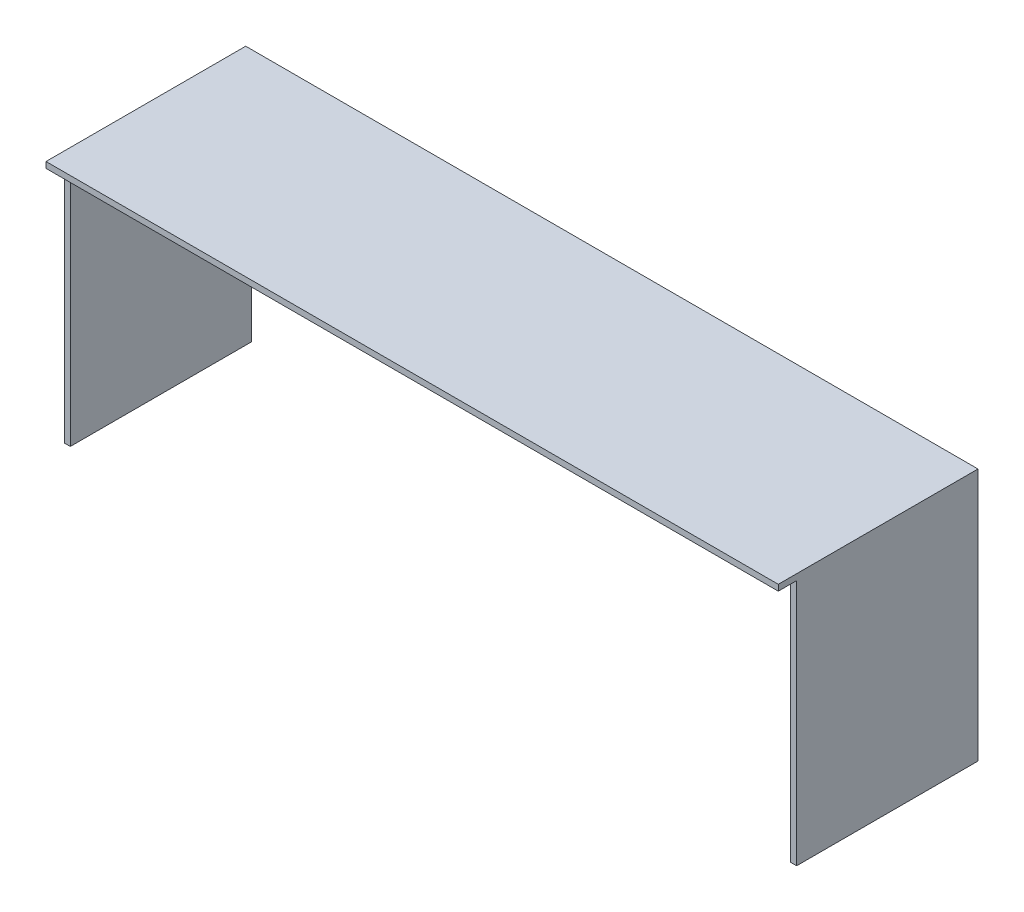
ISO-10303-21;
HEADER;
FILE_DESCRIPTION(('STEP AP214'),'2;1');
FILE_NAME('part.step','',(''),(''),'','','');
FILE_SCHEMA(('AUTOMOTIVE_DESIGN { 1 0 10303 214 1 1 1 1 }'));
ENDSEC;
DATA;
#1=APPLICATION_CONTEXT('core data for automotive mechanical design processes');
#2=APPLICATION_PROTOCOL_DEFINITION('international standard','automotive_design',2000,#1);
#3=PRODUCT_CONTEXT('',#1,'mechanical');
#4=PRODUCT('Part','Part','',(#3));
#5=PRODUCT_RELATED_PRODUCT_CATEGORY('part','',(#4));
#6=PRODUCT_DEFINITION_FORMATION('','',#4);
#7=PRODUCT_DEFINITION_CONTEXT('part definition',#1,'design');
#8=PRODUCT_DEFINITION('design','',#6,#7);
#9=PRODUCT_DEFINITION_SHAPE('','',#8);
#10=(LENGTH_UNIT() NAMED_UNIT(*) SI_UNIT(.MILLI.,.METRE.));
#11=(NAMED_UNIT(*) PLANE_ANGLE_UNIT() SI_UNIT($,.RADIAN.));
#12=(NAMED_UNIT(*) SI_UNIT($,.STERADIAN.) SOLID_ANGLE_UNIT());
#13=UNCERTAINTY_MEASURE_WITH_UNIT(LENGTH_MEASURE(1.E-05),#10,'distance_accuracy_value','');
#14=(GEOMETRIC_REPRESENTATION_CONTEXT(3) GLOBAL_UNCERTAINTY_ASSIGNED_CONTEXT((#13)) GLOBAL_UNIT_ASSIGNED_CONTEXT((#10,
#11,#12)) REPRESENTATION_CONTEXT('',''));
#15=CARTESIAN_POINT('',(0.,0.,0.));
#16=DIRECTION('',(0.,0.,1.));
#17=DIRECTION('',(1.,0.,0.));
#18=AXIS2_PLACEMENT_3D('',#15,#16,#17);
#19=CARTESIAN_POINT('',(0.,0.,0.));
#20=DIRECTION('',(0.,-1.,0.));
#21=DIRECTION('',(0.,0.,-1.));
#22=AXIS2_PLACEMENT_3D('',#19,#20,#21);
#23=PLANE('',#22);
#24=DIRECTION('',(0.,0.,1.));
#25=VECTOR('',#24,1.);
#26=CARTESIAN_POINT('',(-1082.,0.,-300.));
#27=LINE('',#26,#25);
#28=CARTESIAN_POINT('',(-1082.,0.,-235.));
#29=VERTEX_POINT('',#28);
#30=CARTESIAN_POINT('',(-1082.,0.,245.));
#31=VERTEX_POINT('',#30);
#32=EDGE_CURVE('E160',#29,#31,#27,.T.);
#33=ORIENTED_EDGE('',*,*,#32,.F.);
#34=DIRECTION('',(-1.,0.,0.));
#35=VECTOR('',#34,1.);
#36=CARTESIAN_POINT('',(1362.57797490181,0.,-235.));
#37=LINE('',#36,#35);
#38=CARTESIAN_POINT('',(1082.,0.,-235.));
#39=VERTEX_POINT('',#38);
#40=EDGE_CURVE('E152',#39,#29,#37,.T.);
#41=ORIENTED_EDGE('',*,*,#40,.F.);
#42=DIRECTION('',(0.,0.,1.));
#43=VECTOR('',#42,1.);
#44=CARTESIAN_POINT('',(1082.,0.,-300.));
#45=LINE('',#44,#43);
#46=CARTESIAN_POINT('',(1082.,0.,245.));
#47=VERTEX_POINT('',#46);
#48=EDGE_CURVE('E263',#39,#47,#45,.T.);
#49=ORIENTED_EDGE('',*,*,#48,.T.);
#50=DIRECTION('',(1.,0.,0.));
#51=VECTOR('',#50,1.);
#52=CARTESIAN_POINT('',(1100.,0.,245.));
#53=LINE('',#52,#51);
#54=CARTESIAN_POINT('',(1100.,0.,245.));
#55=VERTEX_POINT('',#54);
#56=EDGE_CURVE('E234',#47,#55,#53,.T.);
#57=ORIENTED_EDGE('',*,*,#56,.T.);
#58=DIRECTION('',(0.,0.,-1.));
#59=VECTOR('',#58,1.);
#60=CARTESIAN_POINT('',(1100.,0.,300.));
#61=LINE('',#60,#59);
#62=CARTESIAN_POINT('',(1100.,0.,300.));
#63=VERTEX_POINT('',#62);
#64=EDGE_CURVE('E177',#63,#55,#61,.T.);
#65=ORIENTED_EDGE('',*,*,#64,.F.);
#66=DIRECTION('',(1.,0.,0.));
#67=VECTOR('',#66,1.);
#68=CARTESIAN_POINT('',(-1100.,0.,300.));
#69=LINE('',#68,#67);
#70=CARTESIAN_POINT('',(-1100.,0.,300.));
#71=VERTEX_POINT('',#70);
#72=EDGE_CURVE('E182',#71,#63,#69,.T.);
#73=ORIENTED_EDGE('',*,*,#72,.F.);
#74=DIRECTION('',(0.,0.,1.));
#75=VECTOR('',#74,1.);
#76=CARTESIAN_POINT('',(-1100.,0.,300.));
#77=LINE('',#76,#75);
#78=CARTESIAN_POINT('',(-1100.,0.,245.));
#79=VERTEX_POINT('',#78);
#80=EDGE_CURVE('E193',#79,#71,#77,.T.);
#81=ORIENTED_EDGE('',*,*,#80,.F.);
#82=DIRECTION('',(-1.,0.,0.));
#83=VECTOR('',#82,1.);
#84=CARTESIAN_POINT('',(-1100.,0.,245.));
#85=LINE('',#84,#83);
#86=EDGE_CURVE('E159',#31,#79,#85,.T.);
#87=ORIENTED_EDGE('',*,*,#86,.F.);
#88=EDGE_LOOP('',(#33,#41,#49,#57,#65,#73,#81,#87));
#89=FACE_BOUND('',#88,.T.);
#90=ADVANCED_FACE('F37',(#89),#23,.T.);
#91=CARTESIAN_POINT('',(1082.,0.,-300.));
#92=VERTEX_POINT('',#91);
#93=CARTESIAN_POINT('',(1082.,0.,-253.));
#94=VERTEX_POINT('',#93);
#95=EDGE_CURVE('E59',#92,#94,#45,.T.);
#96=ORIENTED_EDGE('',*,*,#95,.T.);
#97=DIRECTION('',(-1.,0.,0.));
#98=VECTOR('',#97,1.);
#99=CARTESIAN_POINT('',(1362.57797490181,0.,-253.));
#100=LINE('',#99,#98);
#101=CARTESIAN_POINT('',(-1082.,0.,-253.));
#102=VERTEX_POINT('',#101);
#103=EDGE_CURVE('E52',#94,#102,#100,.T.);
#104=ORIENTED_EDGE('',*,*,#103,.T.);
#105=CARTESIAN_POINT('',(-1082.,0.,-300.));
#106=VERTEX_POINT('',#105);
#107=EDGE_CURVE('E149',#106,#102,#27,.T.);
#108=ORIENTED_EDGE('',*,*,#107,.F.);
#109=DIRECTION('',(-1.,0.,0.));
#110=VECTOR('',#109,1.);
#111=CARTESIAN_POINT('',(-1100.,0.,-300.));
#112=LINE('',#111,#110);
#113=EDGE_CURVE('E191',#92,#106,#112,.T.);
#114=ORIENTED_EDGE('',*,*,#113,.F.);
#115=EDGE_LOOP('',(#96,#104,#108,#114));
#116=FACE_BOUND('',#115,.T.);
#117=ADVANCED_FACE('F147',(#116),#23,.T.);
#118=CARTESIAN_POINT('',(-1082.,-742.,-300.));
#119=DIRECTION('',(-1.,0.,0.));
#120=DIRECTION('',(0.,0.,1.));
#121=AXIS2_PLACEMENT_3D('',#118,#119,#120);
#122=PLANE('',#121);
#123=DIRECTION('',(0.,-1.,0.));
#124=VECTOR('',#123,1.);
#125=CARTESIAN_POINT('',(-1082.,0.,-235.));
#126=LINE('',#125,#124);
#127=CARTESIAN_POINT('',(-1082.,-280.,-235.));
#128=VERTEX_POINT('',#127);
#129=EDGE_CURVE('E143',#29,#128,#126,.T.);
#130=ORIENTED_EDGE('',*,*,#129,.F.);
#131=ORIENTED_EDGE('',*,*,#32,.T.);
#132=DIRECTION('',(0.,1.,0.));
#133=VECTOR('',#132,1.);
#134=CARTESIAN_POINT('',(-1082.,-742.,245.));
#135=LINE('',#134,#133);
#136=CARTESIAN_POINT('',(-1082.,-742.,245.));
#137=VERTEX_POINT('',#136);
#138=EDGE_CURVE('E173',#137,#31,#135,.T.);
#139=ORIENTED_EDGE('',*,*,#138,.F.);
#140=DIRECTION('',(0.,0.,1.));
#141=VECTOR('',#140,1.);
#142=CARTESIAN_POINT('',(-1082.,-742.,-300.));
#143=LINE('',#142,#141);
#144=CARTESIAN_POINT('',(-1082.,-742.,-300.));
#145=VERTEX_POINT('',#144);
#146=EDGE_CURVE('E212',#145,#137,#143,.T.);
#147=ORIENTED_EDGE('',*,*,#146,.F.);
#148=DIRECTION('',(0.,1.,0.));
#149=VECTOR('',#148,1.);
#150=CARTESIAN_POINT('',(-1082.,-742.,-300.));
#151=LINE('',#150,#149);
#152=EDGE_CURVE('E158',#145,#106,#151,.T.);
#153=ORIENTED_EDGE('',*,*,#152,.T.);
#154=ORIENTED_EDGE('',*,*,#107,.T.);
#155=DIRECTION('',(0.,1.,0.));
#156=VECTOR('',#155,1.);
#157=CARTESIAN_POINT('',(-1082.,0.,-253.));
#158=LINE('',#157,#156);
#159=CARTESIAN_POINT('',(-1082.,-280.,-253.));
#160=VERTEX_POINT('',#159);
#161=EDGE_CURVE('E135',#160,#102,#158,.T.);
#162=ORIENTED_EDGE('',*,*,#161,.F.);
#163=DIRECTION('',(0.,0.,-1.));
#164=VECTOR('',#163,1.);
#165=CARTESIAN_POINT('',(-1082.,-280.,-253.));
#166=LINE('',#165,#164);
#167=EDGE_CURVE('E277',#128,#160,#166,.T.);
#168=ORIENTED_EDGE('',*,*,#167,.F.);
#169=EDGE_LOOP('',(#130,#131,#139,#147,#153,#154,#162,#168));
#170=FACE_BOUND('',#169,.T.);
#171=ADVANCED_FACE('F155',(#170),#122,.F.);
#172=CARTESIAN_POINT('',(1082.,-742.,-300.));
#173=DIRECTION('',(-1.,0.,0.));
#174=DIRECTION('',(0.,0.,1.));
#175=AXIS2_PLACEMENT_3D('',#172,#173,#174);
#176=PLANE('',#175);
#177=ORIENTED_EDGE('',*,*,#48,.F.);
#178=DIRECTION('',(0.,1.,0.));
#179=VECTOR('',#178,1.);
#180=CARTESIAN_POINT('',(1082.,0.,-235.));
#181=LINE('',#180,#179);
#182=CARTESIAN_POINT('',(1082.,-280.,-235.));
#183=VERTEX_POINT('',#182);
#184=EDGE_CURVE('E271',#183,#39,#181,.T.);
#185=ORIENTED_EDGE('',*,*,#184,.F.);
#186=DIRECTION('',(0.,0.,1.));
#187=VECTOR('',#186,1.);
#188=CARTESIAN_POINT('',(1082.,-280.,-253.));
#189=LINE('',#188,#187);
#190=CARTESIAN_POINT('',(1082.,-280.,-253.));
#191=VERTEX_POINT('',#190);
#192=EDGE_CURVE('E151',#191,#183,#189,.T.);
#193=ORIENTED_EDGE('',*,*,#192,.F.);
#194=DIRECTION('',(0.,-1.,0.));
#195=VECTOR('',#194,1.);
#196=CARTESIAN_POINT('',(1082.,0.,-253.));
#197=LINE('',#196,#195);
#198=EDGE_CURVE('E264',#94,#191,#197,.T.);
#199=ORIENTED_EDGE('',*,*,#198,.F.);
#200=ORIENTED_EDGE('',*,*,#95,.F.);
#201=DIRECTION('',(0.,1.,0.));
#202=VECTOR('',#201,1.);
#203=CARTESIAN_POINT('',(1082.,-742.,-300.));
#204=LINE('',#203,#202);
#205=CARTESIAN_POINT('',(1082.,-742.,-300.));
#206=VERTEX_POINT('',#205);
#207=EDGE_CURVE('E255',#206,#92,#204,.T.);
#208=ORIENTED_EDGE('',*,*,#207,.F.);
#209=DIRECTION('',(0.,0.,1.));
#210=VECTOR('',#209,1.);
#211=CARTESIAN_POINT('',(1082.,-742.,-300.));
#212=LINE('',#211,#210);
#213=CARTESIAN_POINT('',(1082.,-742.,245.));
#214=VERTEX_POINT('',#213);
#215=EDGE_CURVE('E254',#206,#214,#212,.T.);
#216=ORIENTED_EDGE('',*,*,#215,.T.);
#217=DIRECTION('',(0.,1.,0.));
#218=VECTOR('',#217,1.);
#219=CARTESIAN_POINT('',(1082.,-742.,245.));
#220=LINE('',#219,#218);
#221=EDGE_CURVE('E257',#214,#47,#220,.T.);
#222=ORIENTED_EDGE('',*,*,#221,.T.);
#223=EDGE_LOOP('',(#177,#185,#193,#199,#200,#208,#216,#222));
#224=FACE_BOUND('',#223,.T.);
#225=ADVANCED_FACE('F287',(#224),#176,.T.);
#226=CARTESIAN_POINT('',(1100.,18.,300.));
#227=DIRECTION('',(-1.,0.,0.));
#228=DIRECTION('',(0.,0.,1.));
#229=AXIS2_PLACEMENT_3D('',#226,#227,#228);
#230=PLANE('',#229);
#231=ORIENTED_EDGE('',*,*,#64,.T.);
#232=DIRECTION('',(0.,1.,0.));
#233=VECTOR('',#232,1.);
#234=CARTESIAN_POINT('',(1100.,-742.,245.));
#235=LINE('',#234,#233);
#236=CARTESIAN_POINT('',(1100.,-742.,245.));
#237=VERTEX_POINT('',#236);
#238=EDGE_CURVE('E165',#237,#55,#235,.T.);
#239=ORIENTED_EDGE('',*,*,#238,.F.);
#240=DIRECTION('',(0.,0.,-1.));
#241=VECTOR('',#240,1.);
#242=CARTESIAN_POINT('',(1100.,-742.,-300.));
#243=LINE('',#242,#241);
#244=CARTESIAN_POINT('',(1100.,-742.,-300.));
#245=VERTEX_POINT('',#244);
#246=EDGE_CURVE('E245',#237,#245,#243,.T.);
#247=ORIENTED_EDGE('',*,*,#246,.T.);
#248=DIRECTION('',(0.,-1.,0.));
#249=VECTOR('',#248,1.);
#250=CARTESIAN_POINT('',(1100.,18.,-300.));
#251=LINE('',#250,#249);
#252=CARTESIAN_POINT('',(1100.,18.,-300.));
#253=VERTEX_POINT('',#252);
#254=EDGE_CURVE('E11',#253,#245,#251,.T.);
#255=ORIENTED_EDGE('',*,*,#254,.F.);
#256=DIRECTION('',(0.,0.,-1.));
#257=VECTOR('',#256,1.);
#258=CARTESIAN_POINT('',(1100.,18.,300.));
#259=LINE('',#258,#257);
#260=CARTESIAN_POINT('',(1100.,18.,300.));
#261=VERTEX_POINT('',#260);
#262=EDGE_CURVE('E178',#261,#253,#259,.T.);
#263=ORIENTED_EDGE('',*,*,#262,.F.);
#264=DIRECTION('',(0.,-1.,0.));
#265=VECTOR('',#264,1.);
#266=CARTESIAN_POINT('',(1100.,18.,300.));
#267=LINE('',#266,#265);
#268=EDGE_CURVE('E188',#261,#63,#267,.T.);
#269=ORIENTED_EDGE('',*,*,#268,.T.);
#270=EDGE_LOOP('',(#231,#239,#247,#255,#263,#269));
#271=FACE_BOUND('',#270,.T.);
#272=ADVANCED_FACE('F39',(#271),#230,.F.);
#273=CARTESIAN_POINT('',(-1100.,18.,-300.));
#274=DIRECTION('',(0.,0.,1.));
#275=DIRECTION('',(1.,0.,0.));
#276=AXIS2_PLACEMENT_3D('',#273,#274,#275);
#277=PLANE('',#276);
#278=ORIENTED_EDGE('',*,*,#254,.T.);
#279=DIRECTION('',(-1.,0.,0.));
#280=VECTOR('',#279,1.);
#281=CARTESIAN_POINT('',(1100.,-742.,-300.));
#282=LINE('',#281,#280);
#283=EDGE_CURVE('E244',#245,#206,#282,.T.);
#284=ORIENTED_EDGE('',*,*,#283,.T.);
#285=ORIENTED_EDGE('',*,*,#207,.T.);
#286=ORIENTED_EDGE('',*,*,#113,.T.);
#287=ORIENTED_EDGE('',*,*,#152,.F.);
#288=DIRECTION('',(1.,0.,0.));
#289=VECTOR('',#288,1.);
#290=CARTESIAN_POINT('',(-1100.,-742.,-300.));
#291=LINE('',#290,#289);
#292=CARTESIAN_POINT('',(-1100.,-742.,-300.));
#293=VERTEX_POINT('',#292);
#294=EDGE_CURVE('E209',#293,#145,#291,.T.);
#295=ORIENTED_EDGE('',*,*,#294,.F.);
#296=DIRECTION('',(0.,-1.,0.));
#297=VECTOR('',#296,1.);
#298=CARTESIAN_POINT('',(-1100.,18.,-300.));
#299=LINE('',#298,#297);
#300=CARTESIAN_POINT('',(-1100.,18.,-300.));
#301=VERTEX_POINT('',#300);
#302=EDGE_CURVE('E45',#301,#293,#299,.T.);
#303=ORIENTED_EDGE('',*,*,#302,.F.);
#304=DIRECTION('',(-1.,0.,0.));
#305=VECTOR('',#304,1.);
#306=CARTESIAN_POINT('',(-1100.,18.,-300.));
#307=LINE('',#306,#305);
#308=EDGE_CURVE('E181',#253,#301,#307,.T.);
#309=ORIENTED_EDGE('',*,*,#308,.F.);
#310=EDGE_LOOP('',(#278,#284,#285,#286,#287,#295,#303,#309));
#311=FACE_BOUND('',#310,.T.);
#312=ADVANCED_FACE('F210',(#311),#277,.F.);
#313=CARTESIAN_POINT('',(-1100.,18.,300.));
#314=DIRECTION('',(1.,0.,0.));
#315=DIRECTION('',(0.,0.,-1.));
#316=AXIS2_PLACEMENT_3D('',#313,#314,#315);
#317=PLANE('',#316);
#318=ORIENTED_EDGE('',*,*,#302,.T.);
#319=DIRECTION('',(0.,0.,-1.));
#320=VECTOR('',#319,1.);
#321=CARTESIAN_POINT('',(-1100.,-742.,-300.));
#322=LINE('',#321,#320);
#323=CARTESIAN_POINT('',(-1100.,-742.,245.));
#324=VERTEX_POINT('',#323);
#325=EDGE_CURVE('E163',#324,#293,#322,.T.);
#326=ORIENTED_EDGE('',*,*,#325,.F.);
#327=DIRECTION('',(0.,1.,0.));
#328=VECTOR('',#327,1.);
#329=CARTESIAN_POINT('',(-1100.,-742.,245.));
#330=LINE('',#329,#328);
#331=EDGE_CURVE('E170',#324,#79,#330,.T.);
#332=ORIENTED_EDGE('',*,*,#331,.T.);
#333=ORIENTED_EDGE('',*,*,#80,.T.);
#334=DIRECTION('',(0.,-1.,0.));
#335=VECTOR('',#334,1.);
#336=CARTESIAN_POINT('',(-1100.,18.,300.));
#337=LINE('',#336,#335);
#338=CARTESIAN_POINT('',(-1100.,18.,300.));
#339=VERTEX_POINT('',#338);
#340=EDGE_CURVE('E198',#339,#71,#337,.T.);
#341=ORIENTED_EDGE('',*,*,#340,.F.);
#342=DIRECTION('',(0.,0.,1.));
#343=VECTOR('',#342,1.);
#344=CARTESIAN_POINT('',(-1100.,18.,300.));
#345=LINE('',#344,#343);
#346=EDGE_CURVE('E184',#301,#339,#345,.T.);
#347=ORIENTED_EDGE('',*,*,#346,.F.);
#348=EDGE_LOOP('',(#318,#326,#332,#333,#341,#347));
#349=FACE_BOUND('',#348,.T.);
#350=ADVANCED_FACE('F205',(#349),#317,.F.);
#351=CARTESIAN_POINT('',(-1100.,18.,300.));
#352=DIRECTION('',(0.,0.,-1.));
#353=DIRECTION('',(-1.,0.,0.));
#354=AXIS2_PLACEMENT_3D('',#351,#352,#353);
#355=PLANE('',#354);
#356=ORIENTED_EDGE('',*,*,#72,.T.);
#357=ORIENTED_EDGE('',*,*,#268,.F.);
#358=DIRECTION('',(1.,0.,0.));
#359=VECTOR('',#358,1.);
#360=CARTESIAN_POINT('',(-1100.,18.,300.));
#361=LINE('',#360,#359);
#362=EDGE_CURVE('E186',#339,#261,#361,.T.);
#363=ORIENTED_EDGE('',*,*,#362,.F.);
#364=ORIENTED_EDGE('',*,*,#340,.T.);
#365=EDGE_LOOP('',(#356,#357,#363,#364));
#366=FACE_BOUND('',#365,.T.);
#367=ADVANCED_FACE('F229',(#366),#355,.F.);
#368=CARTESIAN_POINT('',(0.,18.,0.));
#369=DIRECTION('',(0.,-1.,0.));
#370=DIRECTION('',(0.,0.,-1.));
#371=AXIS2_PLACEMENT_3D('',#368,#369,#370);
#372=PLANE('',#371);
#373=ORIENTED_EDGE('',*,*,#262,.T.);
#374=ORIENTED_EDGE('',*,*,#308,.T.);
#375=ORIENTED_EDGE('',*,*,#346,.T.);
#376=ORIENTED_EDGE('',*,*,#362,.T.);
#377=EDGE_LOOP('',(#373,#374,#375,#376));
#378=FACE_BOUND('',#377,.T.);
#379=ADVANCED_FACE('F241',(#378),#372,.F.);
#380=CARTESIAN_POINT('',(-1100.,-742.,245.));
#381=DIRECTION('',(0.,0.,-1.));
#382=DIRECTION('',(-1.,0.,0.));
#383=AXIS2_PLACEMENT_3D('',#380,#381,#382);
#384=PLANE('',#383);
#385=ORIENTED_EDGE('',*,*,#86,.T.);
#386=ORIENTED_EDGE('',*,*,#331,.F.);
#387=DIRECTION('',(-1.,0.,0.));
#388=VECTOR('',#387,1.);
#389=CARTESIAN_POINT('',(-1100.,-742.,245.));
#390=LINE('',#389,#388);
#391=EDGE_CURVE('E167',#137,#324,#390,.T.);
#392=ORIENTED_EDGE('',*,*,#391,.F.);
#393=ORIENTED_EDGE('',*,*,#138,.T.);
#394=EDGE_LOOP('',(#385,#386,#392,#393));
#395=FACE_BOUND('',#394,.T.);
#396=ADVANCED_FACE('F224',(#395),#384,.F.);
#397=CARTESIAN_POINT('',(0.,-742.,0.));
#398=DIRECTION('',(0.,1.,0.));
#399=DIRECTION('',(0.,0.,1.));
#400=AXIS2_PLACEMENT_3D('',#397,#398,#399);
#401=PLANE('',#400);
#402=ORIENTED_EDGE('',*,*,#325,.T.);
#403=ORIENTED_EDGE('',*,*,#294,.T.);
#404=ORIENTED_EDGE('',*,*,#146,.T.);
#405=ORIENTED_EDGE('',*,*,#391,.T.);
#406=EDGE_LOOP('',(#402,#403,#404,#405));
#407=FACE_BOUND('',#406,.T.);
#408=ADVANCED_FACE('F214',(#407),#401,.F.);
#409=CARTESIAN_POINT('',(1100.,-742.,245.));
#410=DIRECTION('',(0.,0.,1.));
#411=DIRECTION('',(1.,0.,0.));
#412=AXIS2_PLACEMENT_3D('',#409,#410,#411);
#413=PLANE('',#412);
#414=ORIENTED_EDGE('',*,*,#56,.F.);
#415=ORIENTED_EDGE('',*,*,#221,.F.);
#416=DIRECTION('',(1.,0.,0.));
#417=VECTOR('',#416,1.);
#418=CARTESIAN_POINT('',(1100.,-742.,245.));
#419=LINE('',#418,#417);
#420=EDGE_CURVE('E249',#214,#237,#419,.T.);
#421=ORIENTED_EDGE('',*,*,#420,.T.);
#422=ORIENTED_EDGE('',*,*,#238,.T.);
#423=EDGE_LOOP('',(#414,#415,#421,#422));
#424=FACE_BOUND('',#423,.T.);
#425=ADVANCED_FACE('F268',(#424),#413,.T.);
#426=CARTESIAN_POINT('',(0.,-742.,0.));
#427=DIRECTION('',(0.,1.,0.));
#428=DIRECTION('',(0.,0.,1.));
#429=AXIS2_PLACEMENT_3D('',#426,#427,#428);
#430=PLANE('',#429);
#431=ORIENTED_EDGE('',*,*,#246,.F.);
#432=ORIENTED_EDGE('',*,*,#420,.F.);
#433=ORIENTED_EDGE('',*,*,#215,.F.);
#434=ORIENTED_EDGE('',*,*,#283,.F.);
#435=EDGE_LOOP('',(#431,#432,#433,#434));
#436=FACE_BOUND('',#435,.T.);
#437=ADVANCED_FACE('F252',(#436),#430,.F.);
#438=CARTESIAN_POINT('',(1362.57797490181,-280.,-253.));
#439=DIRECTION('',(0.,1.,0.));
#440=DIRECTION('',(0.,0.,1.));
#441=AXIS2_PLACEMENT_3D('',#438,#439,#440);
#442=PLANE('',#441);
#443=DIRECTION('',(-1.,0.,0.));
#444=VECTOR('',#443,1.);
#445=CARTESIAN_POINT('',(1362.57797490181,-280.,-253.));
#446=LINE('',#445,#444);
#447=EDGE_CURVE('E138',#191,#160,#446,.T.);
#448=ORIENTED_EDGE('',*,*,#447,.F.);
#449=ORIENTED_EDGE('',*,*,#192,.T.);
#450=DIRECTION('',(-1.,0.,0.));
#451=VECTOR('',#450,1.);
#452=CARTESIAN_POINT('',(1362.57797490181,-280.,-235.));
#453=LINE('',#452,#451);
#454=EDGE_CURVE('E274',#183,#128,#453,.T.);
#455=ORIENTED_EDGE('',*,*,#454,.T.);
#456=ORIENTED_EDGE('',*,*,#167,.T.);
#457=EDGE_LOOP('',(#448,#449,#455,#456));
#458=FACE_BOUND('',#457,.T.);
#459=ADVANCED_FACE('F348',(#458),#442,.F.);
#460=CARTESIAN_POINT('',(1362.57797490181,0.,-235.));
#461=DIRECTION('',(0.,0.,-1.));
#462=DIRECTION('',(0.,1.,0.));
#463=AXIS2_PLACEMENT_3D('',#460,#461,#462);
#464=PLANE('',#463);
#465=ORIENTED_EDGE('',*,*,#454,.F.);
#466=ORIENTED_EDGE('',*,*,#184,.T.);
#467=ORIENTED_EDGE('',*,*,#40,.T.);
#468=ORIENTED_EDGE('',*,*,#129,.T.);
#469=EDGE_LOOP('',(#465,#466,#467,#468));
#470=FACE_BOUND('',#469,.T.);
#471=ADVANCED_FACE('F285',(#470),#464,.F.);
#472=CARTESIAN_POINT('',(1362.57797490181,0.,-253.));
#473=DIRECTION('',(0.,0.,1.));
#474=DIRECTION('',(0.,-1.,0.));
#475=AXIS2_PLACEMENT_3D('',#472,#473,#474);
#476=PLANE('',#475);
#477=ORIENTED_EDGE('',*,*,#103,.F.);
#478=ORIENTED_EDGE('',*,*,#198,.T.);
#479=ORIENTED_EDGE('',*,*,#447,.T.);
#480=ORIENTED_EDGE('',*,*,#161,.T.);
#481=EDGE_LOOP('',(#477,#478,#479,#480));
#482=FACE_BOUND('',#481,.T.);
#483=ADVANCED_FACE('F136',(#482),#476,.F.);
#484=CLOSED_SHELL('',(#90,#117,#171,#225,#272,#312,#350,#367,#379,#396,#408,#425,#437,#459,#471,#483));
#485=MANIFOLD_SOLID_BREP('B2',#484);
#486=ADVANCED_BREP_SHAPE_REPRESENTATION('',(#18,#485),#14);
#487=SHAPE_DEFINITION_REPRESENTATION(#9,#486);
ENDSEC;
END-ISO-10303-21;
